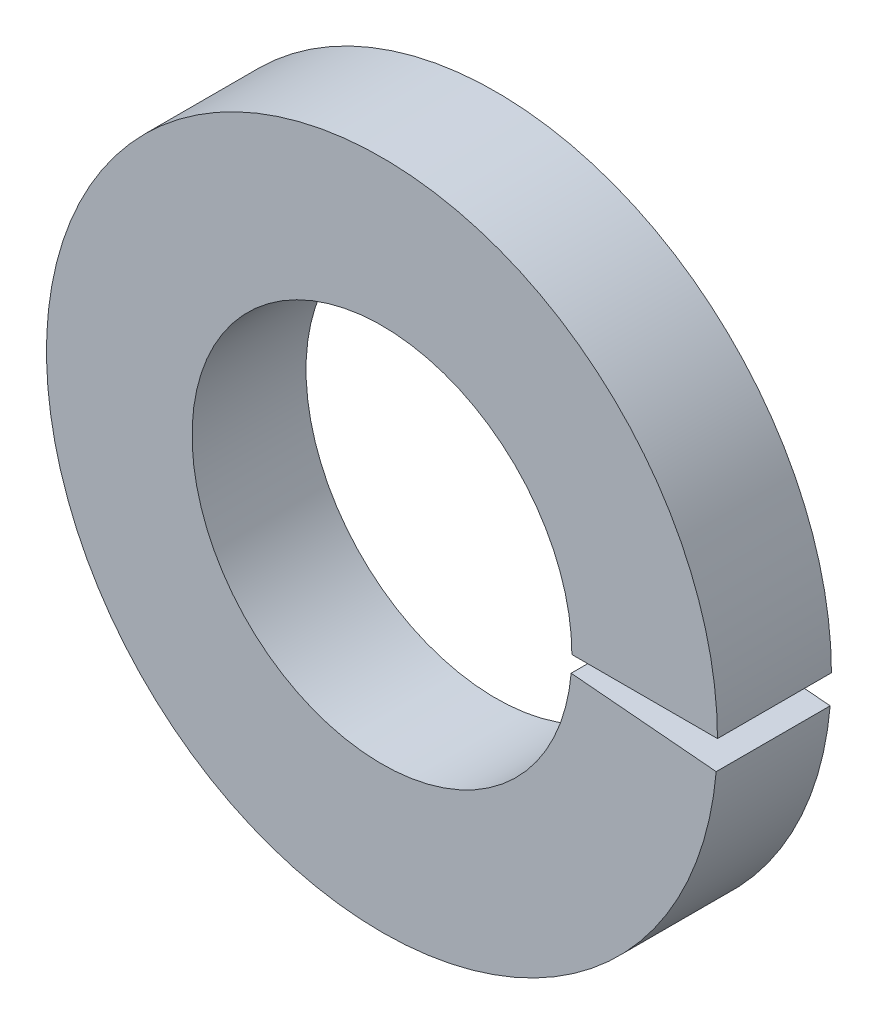
ISO-10303-21;
HEADER;
FILE_DESCRIPTION(('STEP AP214'),'2;1');
FILE_NAME('part.step','',(''),(''),'','','');
FILE_SCHEMA(('AUTOMOTIVE_DESIGN { 1 0 10303 214 1 1 1 1 }'));
ENDSEC;
DATA;
#1=APPLICATION_CONTEXT('core data for automotive mechanical design processes');
#2=APPLICATION_PROTOCOL_DEFINITION('international standard','automotive_design',2000,#1);
#3=PRODUCT_CONTEXT('',#1,'mechanical');
#4=PRODUCT('Part','Part','',(#3));
#5=PRODUCT_RELATED_PRODUCT_CATEGORY('part','',(#4));
#6=PRODUCT_DEFINITION_FORMATION('','',#4);
#7=PRODUCT_DEFINITION_CONTEXT('part definition',#1,'design');
#8=PRODUCT_DEFINITION('design','',#6,#7);
#9=PRODUCT_DEFINITION_SHAPE('','',#8);
#10=(LENGTH_UNIT() NAMED_UNIT(*) SI_UNIT(.MILLI.,.METRE.));
#11=(NAMED_UNIT(*) PLANE_ANGLE_UNIT() SI_UNIT($,.RADIAN.));
#12=(NAMED_UNIT(*) SI_UNIT($,.STERADIAN.) SOLID_ANGLE_UNIT());
#13=UNCERTAINTY_MEASURE_WITH_UNIT(LENGTH_MEASURE(1.E-05),#10,'distance_accuracy_value','');
#14=(GEOMETRIC_REPRESENTATION_CONTEXT(3) GLOBAL_UNCERTAINTY_ASSIGNED_CONTEXT((#13)) GLOBAL_UNIT_ASSIGNED_CONTEXT((#10,
#11,#12)) REPRESENTATION_CONTEXT('',''));
#15=CARTESIAN_POINT('',(0.,0.,0.));
#16=DIRECTION('',(0.,0.,1.));
#17=DIRECTION('',(1.,0.,0.));
#18=AXIS2_PLACEMENT_3D('',#15,#16,#17);
#19=CARTESIAN_POINT('',(0.,0.,0.9));
#20=DIRECTION('',(0.,1.,0.));
#21=DIRECTION('',(0.,0.,1.));
#22=AXIS2_PLACEMENT_3D('',#19,#20,#21);
#23=PLANE('',#22);
#24=DIRECTION('',(1.,0.,0.));
#25=VECTOR('',#24,1.);
#26=CARTESIAN_POINT('',(0.,0.,0.));
#27=LINE('',#26,#25);
#28=CARTESIAN_POINT('',(1.5,0.,0.));
#29=VERTEX_POINT('',#28);
#30=CARTESIAN_POINT('',(2.65,0.,0.));
#31=VERTEX_POINT('',#30);
#32=EDGE_CURVE('E98',#29,#31,#27,.T.);
#33=ORIENTED_EDGE('',*,*,#32,.T.);
#34=DIRECTION('',(0.,0.,-1.));
#35=VECTOR('',#34,1.);
#36=CARTESIAN_POINT('',(2.65,0.,0.9));
#37=LINE('',#36,#35);
#38=CARTESIAN_POINT('',(2.65,0.,0.9));
#39=VERTEX_POINT('',#38);
#40=EDGE_CURVE('E11',#39,#31,#37,.T.);
#41=ORIENTED_EDGE('',*,*,#40,.F.);
#42=DIRECTION('',(1.,0.,0.));
#43=VECTOR('',#42,1.);
#44=CARTESIAN_POINT('',(0.,0.,0.9));
#45=LINE('',#44,#43);
#46=CARTESIAN_POINT('',(1.5,0.,0.9));
#47=VERTEX_POINT('',#46);
#48=EDGE_CURVE('E84',#47,#39,#45,.T.);
#49=ORIENTED_EDGE('',*,*,#48,.F.);
#50=DIRECTION('',(0.,0.,-1.));
#51=VECTOR('',#50,1.);
#52=CARTESIAN_POINT('',(1.5,0.,0.9));
#53=LINE('',#52,#51);
#54=EDGE_CURVE('E51',#47,#29,#53,.T.);
#55=ORIENTED_EDGE('',*,*,#54,.T.);
#56=EDGE_LOOP('',(#33,#41,#49,#55));
#57=FACE_BOUND('',#56,.T.);
#58=ADVANCED_FACE('F35',(#57),#23,.F.);
#59=CARTESIAN_POINT('',(0.,0.,0.9));
#60=DIRECTION('',(0.,0.,-1.));
#61=DIRECTION('',(-1.,0.,0.));
#62=AXIS2_PLACEMENT_3D('',#59,#60,#61);
#63=CYLINDRICAL_SURFACE('',#62,2.65);
#64=CARTESIAN_POINT('',(0.,0.,0.));
#65=DIRECTION('',(0.,0.,1.));
#66=DIRECTION('',(1.,0.,0.));
#67=AXIS2_PLACEMENT_3D('',#64,#65,#66);
#68=CIRCLE('',#67,2.65);
#69=CARTESIAN_POINT('',(2.63991594994313,-0.230962718281295,0.));
#70=VERTEX_POINT('',#69);
#71=EDGE_CURVE('E89',#31,#70,#68,.T.);
#72=ORIENTED_EDGE('',*,*,#71,.T.);
#73=DIRECTION('',(0.,0.,-1.));
#74=VECTOR('',#73,1.);
#75=CARTESIAN_POINT('',(2.63991594994313,-0.230962718281295,0.9));
#76=LINE('',#75,#74);
#77=CARTESIAN_POINT('',(2.63991594994313,-0.230962718281295,0.9));
#78=VERTEX_POINT('',#77);
#79=EDGE_CURVE('E43',#78,#70,#76,.T.);
#80=ORIENTED_EDGE('',*,*,#79,.F.);
#81=CARTESIAN_POINT('',(0.,0.,0.9));
#82=DIRECTION('',(0.,0.,1.));
#83=DIRECTION('',(1.,0.,0.));
#84=AXIS2_PLACEMENT_3D('',#81,#82,#83);
#85=CIRCLE('',#84,2.65);
#86=EDGE_CURVE('E76',#39,#78,#85,.T.);
#87=ORIENTED_EDGE('',*,*,#86,.F.);
#88=ORIENTED_EDGE('',*,*,#40,.T.);
#89=EDGE_LOOP('',(#72,#80,#87,#88));
#90=FACE_BOUND('',#89,.T.);
#91=ADVANCED_FACE('F88',(#90),#63,.T.);
#92=CARTESIAN_POINT('',(0.,0.,0.9));
#93=DIRECTION('',(0.0871557427476584,0.996194698091746,0.));
#94=DIRECTION('',(-0.996194698091746,0.0871557427476584,0.));
#95=AXIS2_PLACEMENT_3D('',#92,#93,#94);
#96=PLANE('',#95);
#97=DIRECTION('',(0.996194698091746,-0.0871557427476584,0.));
#98=VECTOR('',#97,1.);
#99=CARTESIAN_POINT('',(0.,0.,0.));
#100=LINE('',#99,#98);
#101=CARTESIAN_POINT('',(1.49429204713762,-0.130733614121488,0.));
#102=VERTEX_POINT('',#101);
#103=EDGE_CURVE('E101',#102,#70,#100,.T.);
#104=ORIENTED_EDGE('',*,*,#103,.F.);
#105=DIRECTION('',(0.,0.,-1.));
#106=VECTOR('',#105,1.);
#107=CARTESIAN_POINT('',(1.49429204713762,-0.130733614121488,0.9));
#108=LINE('',#107,#106);
#109=CARTESIAN_POINT('',(1.49429204713762,-0.130733614121488,0.9));
#110=VERTEX_POINT('',#109);
#111=EDGE_CURVE('E65',#110,#102,#108,.T.);
#112=ORIENTED_EDGE('',*,*,#111,.F.);
#113=DIRECTION('',(0.996194698091746,-0.0871557427476584,0.));
#114=VECTOR('',#113,1.);
#115=CARTESIAN_POINT('',(0.,0.,0.9));
#116=LINE('',#115,#114);
#117=EDGE_CURVE('E83',#110,#78,#116,.T.);
#118=ORIENTED_EDGE('',*,*,#117,.T.);
#119=ORIENTED_EDGE('',*,*,#79,.T.);
#120=EDGE_LOOP('',(#104,#112,#118,#119));
#121=FACE_BOUND('',#120,.T.);
#122=ADVANCED_FACE('F92',(#121),#96,.T.);
#123=CARTESIAN_POINT('',(0.,0.,0.9));
#124=DIRECTION('',(0.,0.,-1.));
#125=DIRECTION('',(-1.,0.,0.));
#126=AXIS2_PLACEMENT_3D('',#123,#124,#125);
#127=CYLINDRICAL_SURFACE('',#126,1.5);
#128=CARTESIAN_POINT('',(0.,0.,0.));
#129=DIRECTION('',(0.,0.,1.));
#130=DIRECTION('',(1.,0.,0.));
#131=AXIS2_PLACEMENT_3D('',#128,#129,#130);
#132=CIRCLE('',#131,1.5);
#133=EDGE_CURVE('E103',#29,#102,#132,.T.);
#134=ORIENTED_EDGE('',*,*,#133,.F.);
#135=ORIENTED_EDGE('',*,*,#54,.F.);
#136=CARTESIAN_POINT('',(0.,0.,0.9));
#137=DIRECTION('',(0.,0.,1.));
#138=DIRECTION('',(1.,0.,0.));
#139=AXIS2_PLACEMENT_3D('',#136,#137,#138);
#140=CIRCLE('',#139,1.5);
#141=EDGE_CURVE('E93',#47,#110,#140,.T.);
#142=ORIENTED_EDGE('',*,*,#141,.T.);
#143=ORIENTED_EDGE('',*,*,#111,.T.);
#144=EDGE_LOOP('',(#134,#135,#142,#143));
#145=FACE_BOUND('',#144,.T.);
#146=ADVANCED_FACE('F109',(#145),#127,.F.);
#147=CARTESIAN_POINT('',(0.,0.,0.9));
#148=DIRECTION('',(0.,0.,1.));
#149=DIRECTION('',(1.,0.,0.));
#150=AXIS2_PLACEMENT_3D('',#147,#148,#149);
#151=PLANE('',#150);
#152=ORIENTED_EDGE('',*,*,#48,.T.);
#153=ORIENTED_EDGE('',*,*,#86,.T.);
#154=ORIENTED_EDGE('',*,*,#117,.F.);
#155=ORIENTED_EDGE('',*,*,#141,.F.);
#156=EDGE_LOOP('',(#152,#153,#154,#155));
#157=FACE_BOUND('',#156,.T.);
#158=ADVANCED_FACE('F80',(#157),#151,.T.);
#159=CARTESIAN_POINT('',(0.,0.,0.));
#160=DIRECTION('',(0.,0.,1.));
#161=DIRECTION('',(1.,0.,0.));
#162=AXIS2_PLACEMENT_3D('',#159,#160,#161);
#163=PLANE('',#162);
#164=ORIENTED_EDGE('',*,*,#32,.F.);
#165=ORIENTED_EDGE('',*,*,#133,.T.);
#166=ORIENTED_EDGE('',*,*,#103,.T.);
#167=ORIENTED_EDGE('',*,*,#71,.F.);
#168=EDGE_LOOP('',(#164,#165,#166,#167));
#169=FACE_BOUND('',#168,.T.);
#170=ADVANCED_FACE('F108',(#169),#163,.F.);
#171=CLOSED_SHELL('',(#58,#91,#122,#146,#158,#170));
#172=MANIFOLD_SOLID_BREP('B2',#171);
#173=ADVANCED_BREP_SHAPE_REPRESENTATION('',(#18,#172),#14);
#174=SHAPE_DEFINITION_REPRESENTATION(#9,#173);
ENDSEC;
END-ISO-10303-21;
